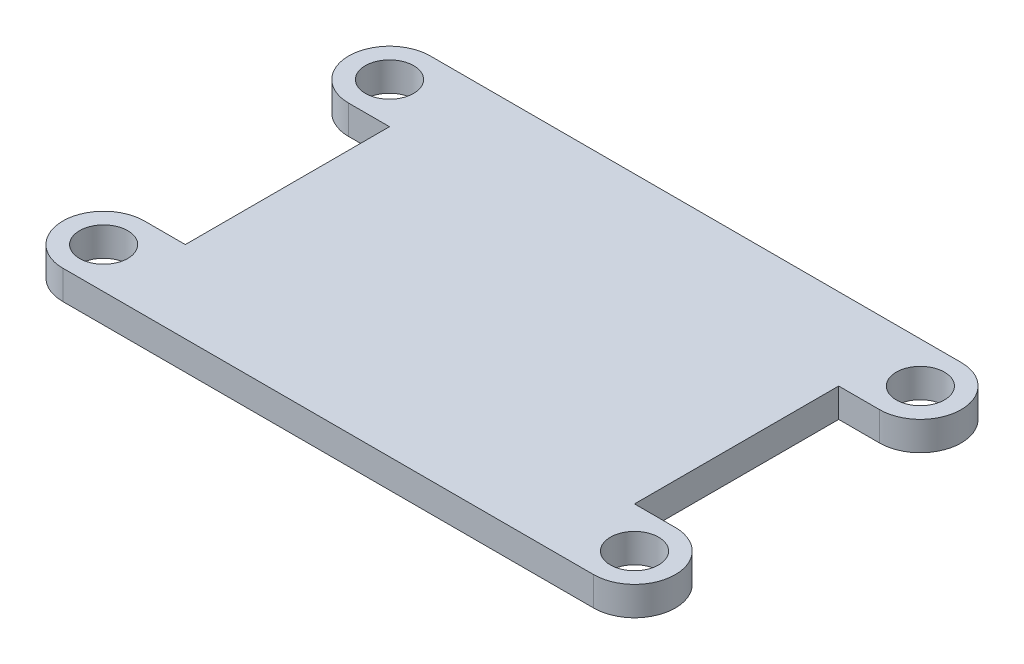
ISO-10303-21;
HEADER;
FILE_DESCRIPTION(('STEP AP214'),'2;1');
FILE_NAME('part.step','',(''),(''),'','','');
FILE_SCHEMA(('AUTOMOTIVE_DESIGN { 1 0 10303 214 1 1 1 1 }'));
ENDSEC;
DATA;
#1=APPLICATION_CONTEXT('core data for automotive mechanical design processes');
#2=APPLICATION_PROTOCOL_DEFINITION('international standard','automotive_design',2000,#1);
#3=PRODUCT_CONTEXT('',#1,'mechanical');
#4=PRODUCT('Part','Part','',(#3));
#5=PRODUCT_RELATED_PRODUCT_CATEGORY('part','',(#4));
#6=PRODUCT_DEFINITION_FORMATION('','',#4);
#7=PRODUCT_DEFINITION_CONTEXT('part definition',#1,'design');
#8=PRODUCT_DEFINITION('design','',#6,#7);
#9=PRODUCT_DEFINITION_SHAPE('','',#8);
#10=(LENGTH_UNIT() NAMED_UNIT(*) SI_UNIT(.MILLI.,.METRE.));
#11=(NAMED_UNIT(*) PLANE_ANGLE_UNIT() SI_UNIT($,.RADIAN.));
#12=(NAMED_UNIT(*) SI_UNIT($,.STERADIAN.) SOLID_ANGLE_UNIT());
#13=UNCERTAINTY_MEASURE_WITH_UNIT(LENGTH_MEASURE(1.E-05),#10,'distance_accuracy_value','');
#14=(GEOMETRIC_REPRESENTATION_CONTEXT(3) GLOBAL_UNCERTAINTY_ASSIGNED_CONTEXT((#13)) GLOBAL_UNIT_ASSIGNED_CONTEXT((#10,
#11,#12)) REPRESENTATION_CONTEXT('',''));
#15=CARTESIAN_POINT('',(0.,0.,0.));
#16=DIRECTION('',(0.,0.,1.));
#17=DIRECTION('',(1.,0.,0.));
#18=AXIS2_PLACEMENT_3D('',#15,#16,#17);
#19=CARTESIAN_POINT('',(16.51,1.8,-8.88999999999999));
#20=DIRECTION('',(0.,-1.,0.));
#21=DIRECTION('',(0.,0.,-1.));
#22=AXIS2_PLACEMENT_3D('',#19,#20,#21);
#23=PLANE('',#22);
#24=DIRECTION('',(-1.,0.,0.));
#25=VECTOR('',#24,1.);
#26=CARTESIAN_POINT('',(13.97,1.8,-11.43));
#27=LINE('',#26,#25);
#28=CARTESIAN_POINT('',(16.51,1.8,-11.43));
#29=VERTEX_POINT('',#28);
#30=CARTESIAN_POINT('',(-16.51,1.8,-11.43));
#31=VERTEX_POINT('',#30);
#32=EDGE_CURVE('E104',#29,#31,#27,.T.);
#33=ORIENTED_EDGE('',*,*,#32,.T.);
#34=CARTESIAN_POINT('',(-16.51,1.8,-8.89));
#35=DIRECTION('',(0.,1.,0.));
#36=DIRECTION('',(0.,0.,1.));
#37=AXIS2_PLACEMENT_3D('',#34,#35,#36);
#38=CIRCLE('',#37,2.54);
#39=CARTESIAN_POINT('',(-16.51,1.8,-6.35));
#40=VERTEX_POINT('',#39);
#41=EDGE_CURVE('E246',#31,#40,#38,.T.);
#42=ORIENTED_EDGE('',*,*,#41,.T.);
#43=DIRECTION('',(1.,0.,0.));
#44=VECTOR('',#43,1.);
#45=CARTESIAN_POINT('',(-16.51,1.8,-6.34999999999999));
#46=LINE('',#45,#44);
#47=CARTESIAN_POINT('',(-13.97,1.8,-6.35));
#48=VERTEX_POINT('',#47);
#49=EDGE_CURVE('E205',#40,#48,#46,.T.);
#50=ORIENTED_EDGE('',*,*,#49,.T.);
#51=DIRECTION('',(0.,0.,1.));
#52=VECTOR('',#51,1.);
#53=CARTESIAN_POINT('',(-13.97,1.8,6.35));
#54=LINE('',#53,#52);
#55=CARTESIAN_POINT('',(-13.97,1.8,6.35));
#56=VERTEX_POINT('',#55);
#57=EDGE_CURVE('E224',#48,#56,#54,.T.);
#58=ORIENTED_EDGE('',*,*,#57,.T.);
#59=DIRECTION('',(-1.,0.,0.));
#60=VECTOR('',#59,1.);
#61=CARTESIAN_POINT('',(-16.51,1.8,6.35));
#62=LINE('',#61,#60);
#63=CARTESIAN_POINT('',(-16.51,1.8,6.35));
#64=VERTEX_POINT('',#63);
#65=EDGE_CURVE('E221',#56,#64,#62,.T.);
#66=ORIENTED_EDGE('',*,*,#65,.T.);
#67=CARTESIAN_POINT('',(-16.51,1.8,8.89));
#68=DIRECTION('',(0.,1.,0.));
#69=DIRECTION('',(0.,0.,1.));
#70=AXIS2_PLACEMENT_3D('',#67,#68,#69);
#71=CIRCLE('',#70,2.54);
#72=CARTESIAN_POINT('',(-16.51,1.8,11.43));
#73=VERTEX_POINT('',#72);
#74=EDGE_CURVE('E223',#64,#73,#71,.T.);
#75=ORIENTED_EDGE('',*,*,#74,.T.);
#76=DIRECTION('',(1.,0.,0.));
#77=VECTOR('',#76,1.);
#78=CARTESIAN_POINT('',(-13.97,1.8,11.43));
#79=LINE('',#78,#77);
#80=CARTESIAN_POINT('',(16.51,1.8,11.43));
#81=VERTEX_POINT('',#80);
#82=EDGE_CURVE('E226',#73,#81,#79,.T.);
#83=ORIENTED_EDGE('',*,*,#82,.T.);
#84=CARTESIAN_POINT('',(16.51,1.8,8.88999999999999));
#85=DIRECTION('',(0.,1.,0.));
#86=DIRECTION('',(0.,0.,-1.));
#87=AXIS2_PLACEMENT_3D('',#84,#85,#86);
#88=CIRCLE('',#87,2.54);
#89=CARTESIAN_POINT('',(16.51,1.8,6.34999999999999));
#90=VERTEX_POINT('',#89);
#91=EDGE_CURVE('E232',#81,#90,#88,.T.);
#92=ORIENTED_EDGE('',*,*,#91,.T.);
#93=DIRECTION('',(-1.,0.,0.));
#94=VECTOR('',#93,1.);
#95=CARTESIAN_POINT('',(16.51,1.8,6.34999999999999));
#96=LINE('',#95,#94);
#97=CARTESIAN_POINT('',(13.97,1.8,6.34999999999999));
#98=VERTEX_POINT('',#97);
#99=EDGE_CURVE('E136',#90,#98,#96,.T.);
#100=ORIENTED_EDGE('',*,*,#99,.T.);
#101=DIRECTION('',(0.,0.,-1.));
#102=VECTOR('',#101,1.);
#103=CARTESIAN_POINT('',(13.97,1.8,6.34999999999999));
#104=LINE('',#103,#102);
#105=CARTESIAN_POINT('',(13.97,1.8,-6.34999999999999));
#106=VERTEX_POINT('',#105);
#107=EDGE_CURVE('E130',#98,#106,#104,.T.);
#108=ORIENTED_EDGE('',*,*,#107,.T.);
#109=DIRECTION('',(1.,0.,0.));
#110=VECTOR('',#109,1.);
#111=CARTESIAN_POINT('',(16.51,1.8,-6.34999999999999));
#112=LINE('',#111,#110);
#113=CARTESIAN_POINT('',(16.51,1.8,-6.34999999999999));
#114=VERTEX_POINT('',#113);
#115=EDGE_CURVE('E134',#106,#114,#112,.T.);
#116=ORIENTED_EDGE('',*,*,#115,.T.);
#117=CARTESIAN_POINT('',(16.51,1.8,-8.88999999999999));
#118=DIRECTION('',(0.,1.,0.));
#119=DIRECTION('',(0.,0.,-1.));
#120=AXIS2_PLACEMENT_3D('',#117,#118,#119);
#121=CIRCLE('',#120,2.54);
#122=EDGE_CURVE('E50',#114,#29,#121,.T.);
#123=ORIENTED_EDGE('',*,*,#122,.T.);
#124=EDGE_LOOP('',(#33,#42,#50,#58,#66,#75,#83,#92,#100,#108,#116,#123));
#125=FACE_BOUND('',#124,.T.);
#126=CARTESIAN_POINT('',(-16.51,1.8,-8.89));
#127=DIRECTION('',(0.,1.,0.));
#128=DIRECTION('',(0.,0.,1.));
#129=AXIS2_PLACEMENT_3D('',#126,#127,#128);
#130=CIRCLE('',#129,1.5);
#131=CARTESIAN_POINT('',(-16.51,1.8,-7.39));
#132=VERTEX_POINT('',#131);
#133=EDGE_CURVE('E156',#132,#132,#130,.T.);
#134=ORIENTED_EDGE('',*,*,#133,.F.);
#135=EDGE_LOOP('',(#134));
#136=FACE_BOUND('',#135,.T.);
#137=CARTESIAN_POINT('',(16.51,1.8,-8.88999999999999));
#138=DIRECTION('',(0.,1.,0.));
#139=DIRECTION('',(0.,0.,-1.));
#140=AXIS2_PLACEMENT_3D('',#137,#138,#139);
#141=CIRCLE('',#140,1.5);
#142=CARTESIAN_POINT('',(16.51,1.8,-10.39));
#143=VERTEX_POINT('',#142);
#144=EDGE_CURVE('E438',#143,#143,#141,.T.);
#145=ORIENTED_EDGE('',*,*,#144,.F.);
#146=EDGE_LOOP('',(#145));
#147=FACE_BOUND('',#146,.T.);
#148=CARTESIAN_POINT('',(16.51,1.8,8.88999999999999));
#149=DIRECTION('',(0.,1.,0.));
#150=DIRECTION('',(0.,0.,1.));
#151=AXIS2_PLACEMENT_3D('',#148,#149,#150);
#152=CIRCLE('',#151,1.5);
#153=CARTESIAN_POINT('',(16.51,1.8,10.39));
#154=VERTEX_POINT('',#153);
#155=EDGE_CURVE('E432',#154,#154,#152,.T.);
#156=ORIENTED_EDGE('',*,*,#155,.F.);
#157=EDGE_LOOP('',(#156));
#158=FACE_BOUND('',#157,.T.);
#159=CARTESIAN_POINT('',(-16.51,1.8,8.89));
#160=DIRECTION('',(0.,1.,0.));
#161=DIRECTION('',(0.,0.,-1.));
#162=AXIS2_PLACEMENT_3D('',#159,#160,#161);
#163=CIRCLE('',#162,1.5);
#164=CARTESIAN_POINT('',(-16.51,1.8,7.39));
#165=VERTEX_POINT('',#164);
#166=EDGE_CURVE('E423',#165,#165,#163,.T.);
#167=ORIENTED_EDGE('',*,*,#166,.F.);
#168=EDGE_LOOP('',(#167));
#169=FACE_BOUND('',#168,.T.);
#170=ADVANCED_FACE('F33',(#125,#136,#147,#158,#169),#23,.F.);
#171=CARTESIAN_POINT('',(16.51,0.,-8.88999999999999));
#172=DIRECTION('',(0.,-1.,0.));
#173=DIRECTION('',(0.,0.,-1.));
#174=AXIS2_PLACEMENT_3D('',#171,#172,#173);
#175=PLANE('',#174);
#176=CARTESIAN_POINT('',(16.51,0.,8.88999999999999));
#177=DIRECTION('',(0.,1.,0.));
#178=DIRECTION('',(0.,0.,1.));
#179=AXIS2_PLACEMENT_3D('',#176,#177,#178);
#180=CIRCLE('',#179,1.5);
#181=CARTESIAN_POINT('',(16.51,0.,10.39));
#182=VERTEX_POINT('',#181);
#183=EDGE_CURVE('E429',#182,#182,#180,.T.);
#184=ORIENTED_EDGE('',*,*,#183,.T.);
#185=EDGE_LOOP('',(#184));
#186=FACE_BOUND('',#185,.T.);
#187=CARTESIAN_POINT('',(-16.51,0.,-8.89));
#188=DIRECTION('',(0.,1.,0.));
#189=DIRECTION('',(0.,0.,1.));
#190=AXIS2_PLACEMENT_3D('',#187,#188,#189);
#191=CIRCLE('',#190,1.5);
#192=CARTESIAN_POINT('',(-16.51,0.,-7.39));
#193=VERTEX_POINT('',#192);
#194=EDGE_CURVE('E250',#193,#193,#191,.T.);
#195=ORIENTED_EDGE('',*,*,#194,.T.);
#196=EDGE_LOOP('',(#195));
#197=FACE_BOUND('',#196,.T.);
#198=DIRECTION('',(-1.,0.,0.));
#199=VECTOR('',#198,1.);
#200=CARTESIAN_POINT('',(-13.97,0.,-11.43));
#201=LINE('',#200,#199);
#202=CARTESIAN_POINT('',(16.51,0.,-11.43));
#203=VERTEX_POINT('',#202);
#204=CARTESIAN_POINT('',(-16.51,0.,-11.43));
#205=VERTEX_POINT('',#204);
#206=EDGE_CURVE('E98',#203,#205,#201,.T.);
#207=ORIENTED_EDGE('',*,*,#206,.F.);
#208=CARTESIAN_POINT('',(16.51,0.,-8.88999999999999));
#209=DIRECTION('',(0.,1.,0.));
#210=DIRECTION('',(0.,0.,-1.));
#211=AXIS2_PLACEMENT_3D('',#208,#209,#210);
#212=CIRCLE('',#211,2.54);
#213=CARTESIAN_POINT('',(16.51,0.,-6.34999999999999));
#214=VERTEX_POINT('',#213);
#215=EDGE_CURVE('E175',#214,#203,#212,.T.);
#216=ORIENTED_EDGE('',*,*,#215,.F.);
#217=DIRECTION('',(1.,0.,0.));
#218=VECTOR('',#217,1.);
#219=CARTESIAN_POINT('',(16.51,0.,-6.34999999999999));
#220=LINE('',#219,#218);
#221=CARTESIAN_POINT('',(13.97,0.,-6.34999999999999));
#222=VERTEX_POINT('',#221);
#223=EDGE_CURVE('E91',#222,#214,#220,.T.);
#224=ORIENTED_EDGE('',*,*,#223,.F.);
#225=DIRECTION('',(0.,0.,-1.));
#226=VECTOR('',#225,1.);
#227=CARTESIAN_POINT('',(13.97,0.,6.34999999999999));
#228=LINE('',#227,#226);
#229=CARTESIAN_POINT('',(13.97,0.,6.34999999999999));
#230=VERTEX_POINT('',#229);
#231=EDGE_CURVE('E144',#230,#222,#228,.T.);
#232=ORIENTED_EDGE('',*,*,#231,.F.);
#233=DIRECTION('',(-1.,0.,0.));
#234=VECTOR('',#233,1.);
#235=CARTESIAN_POINT('',(16.51,0.,6.34999999999999));
#236=LINE('',#235,#234);
#237=CARTESIAN_POINT('',(16.51,0.,6.34999999999999));
#238=VERTEX_POINT('',#237);
#239=EDGE_CURVE('E171',#238,#230,#236,.T.);
#240=ORIENTED_EDGE('',*,*,#239,.F.);
#241=CARTESIAN_POINT('',(16.51,0.,8.88999999999999));
#242=DIRECTION('',(0.,1.,0.));
#243=DIRECTION('',(0.,0.,-1.));
#244=AXIS2_PLACEMENT_3D('',#241,#242,#243);
#245=CIRCLE('',#244,2.54);
#246=CARTESIAN_POINT('',(16.51,0.,11.43));
#247=VERTEX_POINT('',#246);
#248=EDGE_CURVE('E169',#247,#238,#245,.T.);
#249=ORIENTED_EDGE('',*,*,#248,.F.);
#250=DIRECTION('',(1.,0.,0.));
#251=VECTOR('',#250,1.);
#252=CARTESIAN_POINT('',(13.97,0.,11.43));
#253=LINE('',#252,#251);
#254=CARTESIAN_POINT('',(-16.51,0.,11.43));
#255=VERTEX_POINT('',#254);
#256=EDGE_CURVE('E167',#255,#247,#253,.T.);
#257=ORIENTED_EDGE('',*,*,#256,.F.);
#258=CARTESIAN_POINT('',(-16.51,0.,8.89));
#259=DIRECTION('',(0.,1.,0.));
#260=DIRECTION('',(0.,0.,1.));
#261=AXIS2_PLACEMENT_3D('',#258,#259,#260);
#262=CIRCLE('',#261,2.54);
#263=CARTESIAN_POINT('',(-16.51,0.,6.35));
#264=VERTEX_POINT('',#263);
#265=EDGE_CURVE('E164',#264,#255,#262,.T.);
#266=ORIENTED_EDGE('',*,*,#265,.F.);
#267=DIRECTION('',(-1.,0.,0.));
#268=VECTOR('',#267,1.);
#269=CARTESIAN_POINT('',(-16.51,0.,6.35));
#270=LINE('',#269,#268);
#271=CARTESIAN_POINT('',(-13.97,0.,6.35));
#272=VERTEX_POINT('',#271);
#273=EDGE_CURVE('E162',#272,#264,#270,.T.);
#274=ORIENTED_EDGE('',*,*,#273,.F.);
#275=DIRECTION('',(0.,0.,1.));
#276=VECTOR('',#275,1.);
#277=CARTESIAN_POINT('',(-13.97,0.,6.35));
#278=LINE('',#277,#276);
#279=CARTESIAN_POINT('',(-13.97,0.,-6.35));
#280=VERTEX_POINT('',#279);
#281=EDGE_CURVE('E160',#280,#272,#278,.T.);
#282=ORIENTED_EDGE('',*,*,#281,.F.);
#283=DIRECTION('',(1.,0.,0.));
#284=VECTOR('',#283,1.);
#285=CARTESIAN_POINT('',(-16.51,0.,-6.34999999999999));
#286=LINE('',#285,#284);
#287=CARTESIAN_POINT('',(-16.51,0.,-6.35));
#288=VERTEX_POINT('',#287);
#289=EDGE_CURVE('E158',#288,#280,#286,.T.);
#290=ORIENTED_EDGE('',*,*,#289,.F.);
#291=CARTESIAN_POINT('',(-16.51,0.,-8.89));
#292=DIRECTION('',(0.,1.,0.));
#293=DIRECTION('',(0.,0.,1.));
#294=AXIS2_PLACEMENT_3D('',#291,#292,#293);
#295=CIRCLE('',#294,2.54);
#296=EDGE_CURVE('E155',#205,#288,#295,.T.);
#297=ORIENTED_EDGE('',*,*,#296,.F.);
#298=EDGE_LOOP('',(#207,#216,#224,#232,#240,#249,#257,#266,#274,#282,#290,#297));
#299=FACE_BOUND('',#298,.T.);
#300=CARTESIAN_POINT('',(16.51,0.,-8.88999999999999));
#301=DIRECTION('',(0.,1.,0.));
#302=DIRECTION('',(0.,0.,-1.));
#303=AXIS2_PLACEMENT_3D('',#300,#301,#302);
#304=CIRCLE('',#303,1.5);
#305=CARTESIAN_POINT('',(16.51,0.,-10.39));
#306=VERTEX_POINT('',#305);
#307=EDGE_CURVE('E435',#306,#306,#304,.T.);
#308=ORIENTED_EDGE('',*,*,#307,.T.);
#309=EDGE_LOOP('',(#308));
#310=FACE_BOUND('',#309,.T.);
#311=CARTESIAN_POINT('',(-16.51,0.,8.89));
#312=DIRECTION('',(0.,1.,0.));
#313=DIRECTION('',(0.,0.,-1.));
#314=AXIS2_PLACEMENT_3D('',#311,#312,#313);
#315=CIRCLE('',#314,1.5);
#316=CARTESIAN_POINT('',(-16.51,0.,7.39));
#317=VERTEX_POINT('',#316);
#318=EDGE_CURVE('E426',#317,#317,#315,.T.);
#319=ORIENTED_EDGE('',*,*,#318,.T.);
#320=EDGE_LOOP('',(#319));
#321=FACE_BOUND('',#320,.T.);
#322=ADVANCED_FACE('F209',(#186,#197,#299,#310,#321),#175,.T.);
#323=CARTESIAN_POINT('',(-13.97,1.8,-11.43));
#324=DIRECTION('',(0.,0.,1.));
#325=DIRECTION('',(1.,0.,0.));
#326=AXIS2_PLACEMENT_3D('',#323,#324,#325);
#327=PLANE('',#326);
#328=ORIENTED_EDGE('',*,*,#206,.T.);
#329=DIRECTION('',(0.,-1.,0.));
#330=VECTOR('',#329,1.);
#331=CARTESIAN_POINT('',(-16.51,1.8,-11.43));
#332=LINE('',#331,#330);
#333=EDGE_CURVE('E11',#31,#205,#332,.T.);
#334=ORIENTED_EDGE('',*,*,#333,.F.);
#335=ORIENTED_EDGE('',*,*,#32,.F.);
#336=DIRECTION('',(0.,-1.,0.));
#337=VECTOR('',#336,1.);
#338=CARTESIAN_POINT('',(16.51,1.8,-11.43));
#339=LINE('',#338,#337);
#340=EDGE_CURVE('E150',#29,#203,#339,.T.);
#341=ORIENTED_EDGE('',*,*,#340,.T.);
#342=EDGE_LOOP('',(#328,#334,#335,#341));
#343=FACE_BOUND('',#342,.T.);
#344=ADVANCED_FACE('F35',(#343),#327,.F.);
#345=CARTESIAN_POINT('',(-16.51,1.8,-8.89));
#346=DIRECTION('',(0.,-1.,0.));
#347=DIRECTION('',(0.,0.,-1.));
#348=AXIS2_PLACEMENT_3D('',#345,#346,#347);
#349=CYLINDRICAL_SURFACE('',#348,2.54);
#350=ORIENTED_EDGE('',*,*,#296,.T.);
#351=DIRECTION('',(0.,-1.,0.));
#352=VECTOR('',#351,1.);
#353=CARTESIAN_POINT('',(-16.51,1.8,-6.35));
#354=LINE('',#353,#352);
#355=EDGE_CURVE('E42',#40,#288,#354,.T.);
#356=ORIENTED_EDGE('',*,*,#355,.F.);
#357=ORIENTED_EDGE('',*,*,#41,.F.);
#358=ORIENTED_EDGE('',*,*,#333,.T.);
#359=EDGE_LOOP('',(#350,#356,#357,#358));
#360=FACE_BOUND('',#359,.T.);
#361=ADVANCED_FACE('F252',(#360),#349,.T.);
#362=CARTESIAN_POINT('',(-16.51,1.8,-6.34999999999999));
#363=DIRECTION('',(0.,0.,-1.));
#364=DIRECTION('',(-1.,0.,0.));
#365=AXIS2_PLACEMENT_3D('',#362,#363,#364);
#366=PLANE('',#365);
#367=ORIENTED_EDGE('',*,*,#289,.T.);
#368=DIRECTION('',(0.,-1.,0.));
#369=VECTOR('',#368,1.);
#370=CARTESIAN_POINT('',(-13.97,1.8,-6.35));
#371=LINE('',#370,#369);
#372=EDGE_CURVE('E196',#48,#280,#371,.T.);
#373=ORIENTED_EDGE('',*,*,#372,.F.);
#374=ORIENTED_EDGE('',*,*,#49,.F.);
#375=ORIENTED_EDGE('',*,*,#355,.T.);
#376=EDGE_LOOP('',(#367,#373,#374,#375));
#377=FACE_BOUND('',#376,.T.);
#378=ADVANCED_FACE('F203',(#377),#366,.F.);
#379=CARTESIAN_POINT('',(-13.97,1.8,6.35));
#380=DIRECTION('',(1.,0.,0.));
#381=DIRECTION('',(0.,0.,-1.));
#382=AXIS2_PLACEMENT_3D('',#379,#380,#381);
#383=PLANE('',#382);
#384=ORIENTED_EDGE('',*,*,#281,.T.);
#385=DIRECTION('',(0.,-1.,0.));
#386=VECTOR('',#385,1.);
#387=CARTESIAN_POINT('',(-13.97,1.8,6.35));
#388=LINE('',#387,#386);
#389=EDGE_CURVE('E193',#56,#272,#388,.T.);
#390=ORIENTED_EDGE('',*,*,#389,.F.);
#391=ORIENTED_EDGE('',*,*,#57,.F.);
#392=ORIENTED_EDGE('',*,*,#372,.T.);
#393=EDGE_LOOP('',(#384,#390,#391,#392));
#394=FACE_BOUND('',#393,.T.);
#395=ADVANCED_FACE('F215',(#394),#383,.F.);
#396=CARTESIAN_POINT('',(-16.51,1.8,6.35));
#397=DIRECTION('',(0.,0.,1.));
#398=DIRECTION('',(1.,0.,0.));
#399=AXIS2_PLACEMENT_3D('',#396,#397,#398);
#400=PLANE('',#399);
#401=ORIENTED_EDGE('',*,*,#273,.T.);
#402=DIRECTION('',(0.,-1.,0.));
#403=VECTOR('',#402,1.);
#404=CARTESIAN_POINT('',(-16.51,1.8,6.35));
#405=LINE('',#404,#403);
#406=EDGE_CURVE('E190',#64,#264,#405,.T.);
#407=ORIENTED_EDGE('',*,*,#406,.F.);
#408=ORIENTED_EDGE('',*,*,#65,.F.);
#409=ORIENTED_EDGE('',*,*,#389,.T.);
#410=EDGE_LOOP('',(#401,#407,#408,#409));
#411=FACE_BOUND('',#410,.T.);
#412=ADVANCED_FACE('F219',(#411),#400,.F.);
#413=CARTESIAN_POINT('',(-16.51,1.8,8.89));
#414=DIRECTION('',(0.,-1.,0.));
#415=DIRECTION('',(0.,0.,-1.));
#416=AXIS2_PLACEMENT_3D('',#413,#414,#415);
#417=CYLINDRICAL_SURFACE('',#416,2.54);
#418=ORIENTED_EDGE('',*,*,#265,.T.);
#419=DIRECTION('',(0.,-1.,0.));
#420=VECTOR('',#419,1.);
#421=CARTESIAN_POINT('',(-16.51,1.8,11.43));
#422=LINE('',#421,#420);
#423=EDGE_CURVE('E187',#73,#255,#422,.T.);
#424=ORIENTED_EDGE('',*,*,#423,.F.);
#425=ORIENTED_EDGE('',*,*,#74,.F.);
#426=ORIENTED_EDGE('',*,*,#406,.T.);
#427=EDGE_LOOP('',(#418,#424,#425,#426));
#428=FACE_BOUND('',#427,.T.);
#429=ADVANCED_FACE('F283',(#428),#417,.T.);
#430=CARTESIAN_POINT('',(13.97,1.8,11.43));
#431=DIRECTION('',(0.,0.,-1.));
#432=DIRECTION('',(-1.,0.,0.));
#433=AXIS2_PLACEMENT_3D('',#430,#431,#432);
#434=PLANE('',#433);
#435=ORIENTED_EDGE('',*,*,#256,.T.);
#436=DIRECTION('',(0.,-1.,0.));
#437=VECTOR('',#436,1.);
#438=CARTESIAN_POINT('',(16.51,1.8,11.43));
#439=LINE('',#438,#437);
#440=EDGE_CURVE('E184',#81,#247,#439,.T.);
#441=ORIENTED_EDGE('',*,*,#440,.F.);
#442=ORIENTED_EDGE('',*,*,#82,.F.);
#443=ORIENTED_EDGE('',*,*,#423,.T.);
#444=EDGE_LOOP('',(#435,#441,#442,#443));
#445=FACE_BOUND('',#444,.T.);
#446=ADVANCED_FACE('F280',(#445),#434,.F.);
#447=CARTESIAN_POINT('',(16.51,1.8,8.88999999999999));
#448=DIRECTION('',(0.,-1.,0.));
#449=DIRECTION('',(0.,0.,-1.));
#450=AXIS2_PLACEMENT_3D('',#447,#448,#449);
#451=CYLINDRICAL_SURFACE('',#450,2.54);
#452=ORIENTED_EDGE('',*,*,#248,.T.);
#453=DIRECTION('',(0.,-1.,0.));
#454=VECTOR('',#453,1.);
#455=CARTESIAN_POINT('',(16.51,1.8,6.34999999999999));
#456=LINE('',#455,#454);
#457=EDGE_CURVE('E181',#90,#238,#456,.T.);
#458=ORIENTED_EDGE('',*,*,#457,.F.);
#459=ORIENTED_EDGE('',*,*,#91,.F.);
#460=ORIENTED_EDGE('',*,*,#440,.T.);
#461=EDGE_LOOP('',(#452,#458,#459,#460));
#462=FACE_BOUND('',#461,.T.);
#463=ADVANCED_FACE('F238',(#462),#451,.T.);
#464=CARTESIAN_POINT('',(16.51,1.8,6.34999999999999));
#465=DIRECTION('',(0.,0.,1.));
#466=DIRECTION('',(1.,0.,0.));
#467=AXIS2_PLACEMENT_3D('',#464,#465,#466);
#468=PLANE('',#467);
#469=ORIENTED_EDGE('',*,*,#239,.T.);
#470=DIRECTION('',(0.,-1.,0.));
#471=VECTOR('',#470,1.);
#472=CARTESIAN_POINT('',(13.97,1.8,6.34999999999999));
#473=LINE('',#472,#471);
#474=EDGE_CURVE('E145',#98,#230,#473,.T.);
#475=ORIENTED_EDGE('',*,*,#474,.F.);
#476=ORIENTED_EDGE('',*,*,#99,.F.);
#477=ORIENTED_EDGE('',*,*,#457,.T.);
#478=EDGE_LOOP('',(#469,#475,#476,#477));
#479=FACE_BOUND('',#478,.T.);
#480=ADVANCED_FACE('F242',(#479),#468,.F.);
#481=CARTESIAN_POINT('',(13.97,1.8,6.34999999999999));
#482=DIRECTION('',(-1.,0.,0.));
#483=DIRECTION('',(0.,0.,1.));
#484=AXIS2_PLACEMENT_3D('',#481,#482,#483);
#485=PLANE('',#484);
#486=ORIENTED_EDGE('',*,*,#231,.T.);
#487=DIRECTION('',(0.,-1.,0.));
#488=VECTOR('',#487,1.);
#489=CARTESIAN_POINT('',(13.97,1.8,-6.34999999999999));
#490=LINE('',#489,#488);
#491=EDGE_CURVE('E141',#106,#222,#490,.T.);
#492=ORIENTED_EDGE('',*,*,#491,.F.);
#493=ORIENTED_EDGE('',*,*,#107,.F.);
#494=ORIENTED_EDGE('',*,*,#474,.T.);
#495=EDGE_LOOP('',(#486,#492,#493,#494));
#496=FACE_BOUND('',#495,.T.);
#497=ADVANCED_FACE('F142',(#496),#485,.F.);
#498=CARTESIAN_POINT('',(16.51,1.8,-6.34999999999999));
#499=DIRECTION('',(0.,0.,-1.));
#500=DIRECTION('',(-1.,0.,0.));
#501=AXIS2_PLACEMENT_3D('',#498,#499,#500);
#502=PLANE('',#501);
#503=ORIENTED_EDGE('',*,*,#223,.T.);
#504=DIRECTION('',(0.,-1.,0.));
#505=VECTOR('',#504,1.);
#506=CARTESIAN_POINT('',(16.51,1.8,-6.34999999999999));
#507=LINE('',#506,#505);
#508=EDGE_CURVE('E146',#114,#214,#507,.T.);
#509=ORIENTED_EDGE('',*,*,#508,.F.);
#510=ORIENTED_EDGE('',*,*,#115,.F.);
#511=ORIENTED_EDGE('',*,*,#491,.T.);
#512=EDGE_LOOP('',(#503,#509,#510,#511));
#513=FACE_BOUND('',#512,.T.);
#514=ADVANCED_FACE('F148',(#513),#502,.F.);
#515=CARTESIAN_POINT('',(16.51,1.8,-8.88999999999999));
#516=DIRECTION('',(0.,-1.,0.));
#517=DIRECTION('',(0.,0.,-1.));
#518=AXIS2_PLACEMENT_3D('',#515,#516,#517);
#519=CYLINDRICAL_SURFACE('',#518,2.54);
#520=ORIENTED_EDGE('',*,*,#215,.T.);
#521=ORIENTED_EDGE('',*,*,#340,.F.);
#522=ORIENTED_EDGE('',*,*,#122,.F.);
#523=ORIENTED_EDGE('',*,*,#508,.T.);
#524=EDGE_LOOP('',(#520,#521,#522,#523));
#525=FACE_BOUND('',#524,.T.);
#526=ADVANCED_FACE('F244',(#525),#519,.T.);
#527=CARTESIAN_POINT('',(-16.51,1.8,-8.89));
#528=DIRECTION('',(0.,-1.,0.));
#529=DIRECTION('',(0.,0.,-1.));
#530=AXIS2_PLACEMENT_3D('',#527,#528,#529);
#531=CYLINDRICAL_SURFACE('',#530,1.5);
#532=ORIENTED_EDGE('',*,*,#133,.T.);
#533=EDGE_LOOP('',(#532));
#534=FACE_BOUND('',#533,.T.);
#535=ORIENTED_EDGE('',*,*,#194,.F.);
#536=EDGE_LOOP('',(#535));
#537=FACE_BOUND('',#536,.T.);
#538=ADVANCED_FACE('F267',(#534,#537),#531,.F.);
#539=CARTESIAN_POINT('',(16.51,1.8,-8.88999999999999));
#540=DIRECTION('',(0.,-1.,0.));
#541=DIRECTION('',(0.,0.,-1.));
#542=AXIS2_PLACEMENT_3D('',#539,#540,#541);
#543=CYLINDRICAL_SURFACE('',#542,1.5);
#544=ORIENTED_EDGE('',*,*,#144,.T.);
#545=EDGE_LOOP('',(#544));
#546=FACE_BOUND('',#545,.T.);
#547=ORIENTED_EDGE('',*,*,#307,.F.);
#548=EDGE_LOOP('',(#547));
#549=FACE_BOUND('',#548,.T.);
#550=ADVANCED_FACE('F333',(#546,#549),#543,.F.);
#551=CARTESIAN_POINT('',(16.51,1.8,8.88999999999999));
#552=DIRECTION('',(0.,-1.,0.));
#553=DIRECTION('',(0.,0.,-1.));
#554=AXIS2_PLACEMENT_3D('',#551,#552,#553);
#555=CYLINDRICAL_SURFACE('',#554,1.5);
#556=ORIENTED_EDGE('',*,*,#155,.T.);
#557=EDGE_LOOP('',(#556));
#558=FACE_BOUND('',#557,.T.);
#559=ORIENTED_EDGE('',*,*,#183,.F.);
#560=EDGE_LOOP('',(#559));
#561=FACE_BOUND('',#560,.T.);
#562=ADVANCED_FACE('F340',(#558,#561),#555,.F.);
#563=CARTESIAN_POINT('',(-16.51,1.8,8.89));
#564=DIRECTION('',(0.,-1.,0.));
#565=DIRECTION('',(0.,0.,-1.));
#566=AXIS2_PLACEMENT_3D('',#563,#564,#565);
#567=CYLINDRICAL_SURFACE('',#566,1.5);
#568=ORIENTED_EDGE('',*,*,#166,.T.);
#569=EDGE_LOOP('',(#568));
#570=FACE_BOUND('',#569,.T.);
#571=ORIENTED_EDGE('',*,*,#318,.F.);
#572=EDGE_LOOP('',(#571));
#573=FACE_BOUND('',#572,.T.);
#574=ADVANCED_FACE('F347',(#570,#573),#567,.F.);
#575=CLOSED_SHELL('',(#170,#322,#344,#361,#378,#395,#412,#429,#446,#463,#480,#497,#514,#526,
#538,#550,#562,#574));
#576=MANIFOLD_SOLID_BREP('B2',#575);
#577=ADVANCED_BREP_SHAPE_REPRESENTATION('',(#18,#576),#14);
#578=SHAPE_DEFINITION_REPRESENTATION(#9,#577);
ENDSEC;
END-ISO-10303-21;
